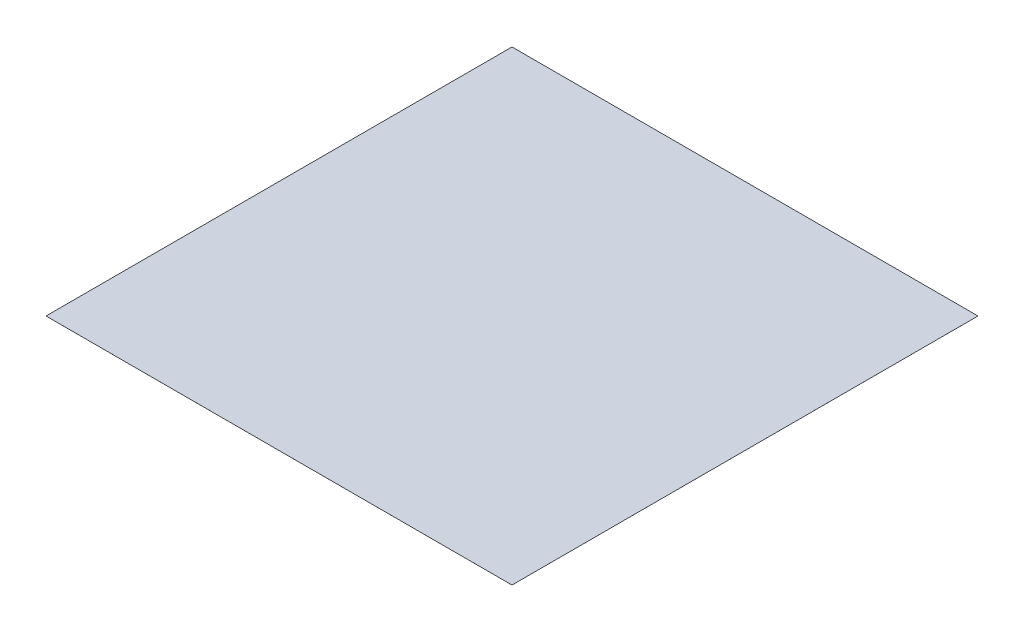
ISO-10303-21;
HEADER;
FILE_DESCRIPTION(('STEP AP214'),'2;1');
FILE_NAME('part.step','',(''),(''),'','','');
FILE_SCHEMA(('AUTOMOTIVE_DESIGN { 1 0 10303 214 1 1 1 1 }'));
ENDSEC;
DATA;
#1=APPLICATION_CONTEXT('core data for automotive mechanical design processes');
#2=APPLICATION_PROTOCOL_DEFINITION('international standard','automotive_design',2000,#1);
#3=PRODUCT_CONTEXT('',#1,'mechanical');
#4=PRODUCT('Part','Part','',(#3));
#5=PRODUCT_RELATED_PRODUCT_CATEGORY('part','',(#4));
#6=PRODUCT_DEFINITION_FORMATION('','',#4);
#7=PRODUCT_DEFINITION_CONTEXT('part definition',#1,'design');
#8=PRODUCT_DEFINITION('design','',#6,#7);
#9=PRODUCT_DEFINITION_SHAPE('','',#8);
#10=(LENGTH_UNIT() NAMED_UNIT(*) SI_UNIT(.MILLI.,.METRE.));
#11=(NAMED_UNIT(*) PLANE_ANGLE_UNIT() SI_UNIT($,.RADIAN.));
#12=(NAMED_UNIT(*) SI_UNIT($,.STERADIAN.) SOLID_ANGLE_UNIT());
#13=UNCERTAINTY_MEASURE_WITH_UNIT(LENGTH_MEASURE(1.E-05),#10,'distance_accuracy_value','');
#14=(GEOMETRIC_REPRESENTATION_CONTEXT(3) GLOBAL_UNCERTAINTY_ASSIGNED_CONTEXT((#13)) GLOBAL_UNIT_ASSIGNED_CONTEXT((#10,
#11,#12)) REPRESENTATION_CONTEXT('',''));
#15=CARTESIAN_POINT('',(0.,0.,0.));
#16=DIRECTION('',(0.,0.,1.));
#17=DIRECTION('',(1.,0.,0.));
#18=AXIS2_PLACEMENT_3D('',#15,#16,#17);
#19=CARTESIAN_POINT('',(-2632.99892709147,0.1,-3395.32139883757));
#20=DIRECTION('',(1.,0.,0.));
#21=DIRECTION('',(0.,0.,-1.));
#22=AXIS2_PLACEMENT_3D('',#19,#20,#21);
#23=PLANE('',#22);
#24=DIRECTION('',(0.,0.,1.));
#25=VECTOR('',#24,1.);
#26=CARTESIAN_POINT('',(-2632.99892709147,0.,-3395.32139883757));
#27=LINE('',#26,#25);
#28=CARTESIAN_POINT('',(-2632.99892709147,0.,-3395.32139883757));
#29=VERTEX_POINT('',#28);
#30=CARTESIAN_POINT('',(-2632.99892709147,0.,2304.67860116244));
#31=VERTEX_POINT('',#30);
#32=EDGE_CURVE('E109',#29,#31,#27,.T.);
#33=ORIENTED_EDGE('',*,*,#32,.T.);
#34=DIRECTION('',(0.,-1.,0.));
#35=VECTOR('',#34,1.);
#36=CARTESIAN_POINT('',(-2632.99892709147,0.1,2304.67860116244));
#37=LINE('',#36,#35);
#38=CARTESIAN_POINT('',(-2632.99892709147,0.1,2304.67860116244));
#39=VERTEX_POINT('',#38);
#40=EDGE_CURVE('E11',#39,#31,#37,.T.);
#41=ORIENTED_EDGE('',*,*,#40,.F.);
#42=DIRECTION('',(0.,0.,1.));
#43=VECTOR('',#42,1.);
#44=CARTESIAN_POINT('',(-2632.99892709147,0.1,-3395.32139883757));
#45=LINE('',#44,#43);
#46=CARTESIAN_POINT('',(-2632.99892709147,0.1,-3395.32139883757));
#47=VERTEX_POINT('',#46);
#48=EDGE_CURVE('E93',#47,#39,#45,.T.);
#49=ORIENTED_EDGE('',*,*,#48,.F.);
#50=DIRECTION('',(0.,-1.,0.));
#51=VECTOR('',#50,1.);
#52=CARTESIAN_POINT('',(-2632.99892709147,0.1,-3395.32139883757));
#53=LINE('',#52,#51);
#54=EDGE_CURVE('E105',#47,#29,#53,.T.);
#55=ORIENTED_EDGE('',*,*,#54,.T.);
#56=EDGE_LOOP('',(#33,#41,#49,#55));
#57=FACE_BOUND('',#56,.T.);
#58=ADVANCED_FACE('F41',(#57),#23,.F.);
#59=CARTESIAN_POINT('',(-2632.99892709147,0.1,2304.67860116244));
#60=DIRECTION('',(0.,0.,-1.));
#61=DIRECTION('',(-1.,0.,0.));
#62=AXIS2_PLACEMENT_3D('',#59,#60,#61);
#63=PLANE('',#62);
#64=DIRECTION('',(1.,0.,0.));
#65=VECTOR('',#64,1.);
#66=CARTESIAN_POINT('',(-2632.99892709147,0.,2304.67860116244));
#67=LINE('',#66,#65);
#68=CARTESIAN_POINT('',(3067.00107290851,0.,2304.67860116244));
#69=VERTEX_POINT('',#68);
#70=EDGE_CURVE('E98',#31,#69,#67,.T.);
#71=ORIENTED_EDGE('',*,*,#70,.T.);
#72=DIRECTION('',(0.,-1.,0.));
#73=VECTOR('',#72,1.);
#74=CARTESIAN_POINT('',(3067.00107290851,0.1,2304.67860116244));
#75=LINE('',#74,#73);
#76=CARTESIAN_POINT('',(3067.00107290851,0.1,2304.67860116244));
#77=VERTEX_POINT('',#76);
#78=EDGE_CURVE('E50',#77,#69,#75,.T.);
#79=ORIENTED_EDGE('',*,*,#78,.F.);
#80=DIRECTION('',(1.,0.,0.));
#81=VECTOR('',#80,1.);
#82=CARTESIAN_POINT('',(-2632.99892709147,0.1,2304.67860116244));
#83=LINE('',#82,#81);
#84=EDGE_CURVE('E88',#39,#77,#83,.T.);
#85=ORIENTED_EDGE('',*,*,#84,.F.);
#86=ORIENTED_EDGE('',*,*,#40,.T.);
#87=EDGE_LOOP('',(#71,#79,#85,#86));
#88=FACE_BOUND('',#87,.T.);
#89=ADVANCED_FACE('F97',(#88),#63,.F.);
#90=CARTESIAN_POINT('',(3067.00107290851,0.1,-3395.32139883757));
#91=DIRECTION('',(-1.,0.,0.));
#92=DIRECTION('',(0.,0.,1.));
#93=AXIS2_PLACEMENT_3D('',#90,#91,#92);
#94=PLANE('',#93);
#95=DIRECTION('',(0.,0.,-1.));
#96=VECTOR('',#95,1.);
#97=CARTESIAN_POINT('',(3067.00107290851,0.,-3395.32139883757));
#98=LINE('',#97,#96);
#99=CARTESIAN_POINT('',(3067.00107290851,0.,-3395.32139883757));
#100=VERTEX_POINT('',#99);
#101=EDGE_CURVE('E75',#69,#100,#98,.T.);
#102=ORIENTED_EDGE('',*,*,#101,.T.);
#103=DIRECTION('',(0.,-1.,0.));
#104=VECTOR('',#103,1.);
#105=CARTESIAN_POINT('',(3067.00107290851,0.1,-3395.32139883757));
#106=LINE('',#105,#104);
#107=CARTESIAN_POINT('',(3067.00107290851,0.1,-3395.32139883757));
#108=VERTEX_POINT('',#107);
#109=EDGE_CURVE('E100',#108,#100,#106,.T.);
#110=ORIENTED_EDGE('',*,*,#109,.F.);
#111=DIRECTION('',(0.,0.,-1.));
#112=VECTOR('',#111,1.);
#113=CARTESIAN_POINT('',(3067.00107290851,0.1,-3395.32139883757));
#114=LINE('',#113,#112);
#115=EDGE_CURVE('E91',#77,#108,#114,.T.);
#116=ORIENTED_EDGE('',*,*,#115,.F.);
#117=ORIENTED_EDGE('',*,*,#78,.T.);
#118=EDGE_LOOP('',(#102,#110,#116,#117));
#119=FACE_BOUND('',#118,.T.);
#120=ADVANCED_FACE('F101',(#119),#94,.F.);
#121=CARTESIAN_POINT('',(-2632.99892709147,0.1,-3395.32139883757));
#122=DIRECTION('',(0.,0.,1.));
#123=DIRECTION('',(1.,0.,0.));
#124=AXIS2_PLACEMENT_3D('',#121,#122,#123);
#125=PLANE('',#124);
#126=DIRECTION('',(-1.,0.,0.));
#127=VECTOR('',#126,1.);
#128=CARTESIAN_POINT('',(-2632.99892709147,0.,-3395.32139883757));
#129=LINE('',#128,#127);
#130=EDGE_CURVE('E81',#100,#29,#129,.T.);
#131=ORIENTED_EDGE('',*,*,#130,.T.);
#132=ORIENTED_EDGE('',*,*,#54,.F.);
#133=DIRECTION('',(-1.,0.,0.));
#134=VECTOR('',#133,1.);
#135=CARTESIAN_POINT('',(-2632.99892709147,0.1,-3395.32139883757));
#136=LINE('',#135,#134);
#137=EDGE_CURVE('E58',#108,#47,#136,.T.);
#138=ORIENTED_EDGE('',*,*,#137,.F.);
#139=ORIENTED_EDGE('',*,*,#109,.T.);
#140=EDGE_LOOP('',(#131,#132,#138,#139));
#141=FACE_BOUND('',#140,.T.);
#142=ADVANCED_FACE('F122',(#141),#125,.F.);
#143=CARTESIAN_POINT('',(0.,0.1,0.));
#144=DIRECTION('',(0.,1.,0.));
#145=DIRECTION('',(0.,0.,1.));
#146=AXIS2_PLACEMENT_3D('',#143,#144,#145);
#147=PLANE('',#146);
#148=ORIENTED_EDGE('',*,*,#48,.T.);
#149=ORIENTED_EDGE('',*,*,#84,.T.);
#150=ORIENTED_EDGE('',*,*,#115,.T.);
#151=ORIENTED_EDGE('',*,*,#137,.T.);
#152=EDGE_LOOP('',(#148,#149,#150,#151));
#153=FACE_BOUND('',#152,.T.);
#154=ADVANCED_FACE('F89',(#153),#147,.T.);
#155=CARTESIAN_POINT('',(0.,0.,0.));
#156=DIRECTION('',(0.,1.,0.));
#157=DIRECTION('',(0.,0.,1.));
#158=AXIS2_PLACEMENT_3D('',#155,#156,#157);
#159=PLANE('',#158);
#160=ORIENTED_EDGE('',*,*,#32,.F.);
#161=ORIENTED_EDGE('',*,*,#130,.F.);
#162=ORIENTED_EDGE('',*,*,#101,.F.);
#163=ORIENTED_EDGE('',*,*,#70,.F.);
#164=EDGE_LOOP('',(#160,#161,#162,#163));
#165=FACE_BOUND('',#164,.T.);
#166=ADVANCED_FACE('F125',(#165),#159,.F.);
#167=CLOSED_SHELL('',(#58,#89,#120,#142,#154,#166));
#168=MANIFOLD_SOLID_BREP('B2',#167);
#169=ADVANCED_BREP_SHAPE_REPRESENTATION('',(#18,#168),#14);
#170=SHAPE_DEFINITION_REPRESENTATION(#9,#169);
ENDSEC;
END-ISO-10303-21;
